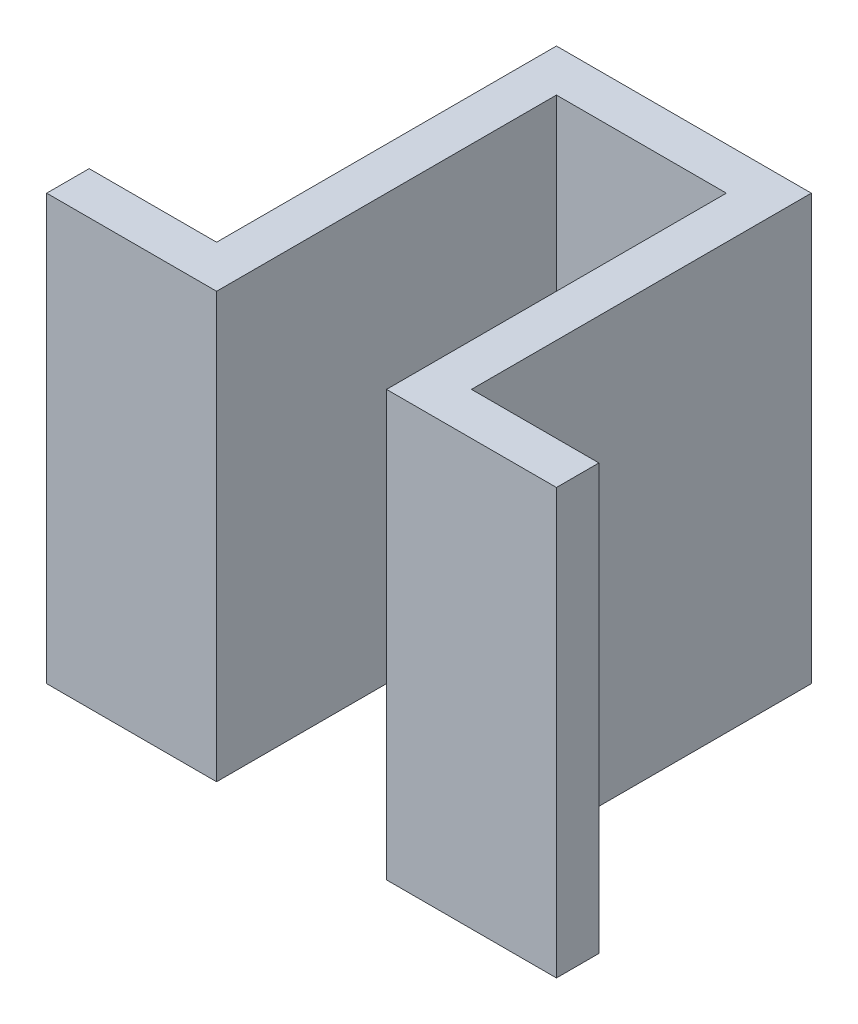
ISO-10303-21;
HEADER;
FILE_DESCRIPTION(('STEP AP214'),'2;1');
FILE_NAME('part.step','',(''),(''),'','','');
FILE_SCHEMA(('AUTOMOTIVE_DESIGN { 1 0 10303 214 1 1 1 1 }'));
ENDSEC;
DATA;
#1=APPLICATION_CONTEXT('core data for automotive mechanical design processes');
#2=APPLICATION_PROTOCOL_DEFINITION('international standard','automotive_design',2000,#1);
#3=PRODUCT_CONTEXT('',#1,'mechanical');
#4=PRODUCT('Part','Part','',(#3));
#5=PRODUCT_RELATED_PRODUCT_CATEGORY('part','',(#4));
#6=PRODUCT_DEFINITION_FORMATION('','',#4);
#7=PRODUCT_DEFINITION_CONTEXT('part definition',#1,'design');
#8=PRODUCT_DEFINITION('design','',#6,#7);
#9=PRODUCT_DEFINITION_SHAPE('','',#8);
#10=(LENGTH_UNIT() NAMED_UNIT(*) SI_UNIT(.MILLI.,.METRE.));
#11=(NAMED_UNIT(*) PLANE_ANGLE_UNIT() SI_UNIT($,.RADIAN.));
#12=(NAMED_UNIT(*) SI_UNIT($,.STERADIAN.) SOLID_ANGLE_UNIT());
#13=UNCERTAINTY_MEASURE_WITH_UNIT(LENGTH_MEASURE(1.E-05),#10,'distance_accuracy_value','');
#14=(GEOMETRIC_REPRESENTATION_CONTEXT(3) GLOBAL_UNCERTAINTY_ASSIGNED_CONTEXT((#13)) GLOBAL_UNIT_ASSIGNED_CONTEXT((#10,
#11,#12)) REPRESENTATION_CONTEXT('',''));
#15=CARTESIAN_POINT('',(0.,0.,0.));
#16=DIRECTION('',(0.,0.,1.));
#17=DIRECTION('',(1.,0.,0.));
#18=AXIS2_PLACEMENT_3D('',#15,#16,#17);
#19=CARTESIAN_POINT('',(38.1,127.,88.9));
#20=DIRECTION('',(0.,0.,1.));
#21=DIRECTION('',(1.,0.,0.));
#22=AXIS2_PLACEMENT_3D('',#19,#20,#21);
#23=PLANE('',#22);
#24=DIRECTION('',(-1.,0.,0.));
#25=VECTOR('',#24,1.);
#26=CARTESIAN_POINT('',(38.1,0.,88.9));
#27=LINE('',#26,#25);
#28=CARTESIAN_POINT('',(76.2,0.,88.9));
#29=VERTEX_POINT('',#28);
#30=CARTESIAN_POINT('',(38.1,0.,88.9));
#31=VERTEX_POINT('',#30);
#32=EDGE_CURVE('E159',#29,#31,#27,.T.);
#33=ORIENTED_EDGE('',*,*,#32,.T.);
#34=DIRECTION('',(0.,-1.,0.));
#35=VECTOR('',#34,1.);
#36=CARTESIAN_POINT('',(38.1,127.,88.9));
#37=LINE('',#36,#35);
#38=CARTESIAN_POINT('',(38.1,127.,88.9));
#39=VERTEX_POINT('',#38);
#40=EDGE_CURVE('E11',#39,#31,#37,.T.);
#41=ORIENTED_EDGE('',*,*,#40,.F.);
#42=DIRECTION('',(-1.,0.,0.));
#43=VECTOR('',#42,1.);
#44=CARTESIAN_POINT('',(38.1,127.,88.9));
#45=LINE('',#44,#43);
#46=CARTESIAN_POINT('',(76.2,127.,88.9));
#47=VERTEX_POINT('',#46);
#48=EDGE_CURVE('E181',#47,#39,#45,.T.);
#49=ORIENTED_EDGE('',*,*,#48,.F.);
#50=DIRECTION('',(0.,-1.,0.));
#51=VECTOR('',#50,1.);
#52=CARTESIAN_POINT('',(76.2,127.,88.9));
#53=LINE('',#52,#51);
#54=EDGE_CURVE('E155',#47,#29,#53,.T.);
#55=ORIENTED_EDGE('',*,*,#54,.T.);
#56=EDGE_LOOP('',(#33,#41,#49,#55));
#57=FACE_BOUND('',#56,.T.);
#58=ADVANCED_FACE('F39',(#57),#23,.F.);
#59=CARTESIAN_POINT('',(38.1,127.,-12.7));
#60=DIRECTION('',(-1.,0.,0.));
#61=DIRECTION('',(0.,0.,1.));
#62=AXIS2_PLACEMENT_3D('',#59,#60,#61);
#63=PLANE('',#62);
#64=DIRECTION('',(0.,0.,-1.));
#65=VECTOR('',#64,1.);
#66=CARTESIAN_POINT('',(38.1,0.,-12.7));
#67=LINE('',#66,#65);
#68=CARTESIAN_POINT('',(38.1,0.,-12.7));
#69=VERTEX_POINT('',#68);
#70=EDGE_CURVE('E162',#31,#69,#67,.T.);
#71=ORIENTED_EDGE('',*,*,#70,.T.);
#72=DIRECTION('',(0.,-1.,0.));
#73=VECTOR('',#72,1.);
#74=CARTESIAN_POINT('',(38.1,127.,-12.7));
#75=LINE('',#74,#73);
#76=CARTESIAN_POINT('',(38.1,127.,-12.7));
#77=VERTEX_POINT('',#76);
#78=EDGE_CURVE('E47',#77,#69,#75,.T.);
#79=ORIENTED_EDGE('',*,*,#78,.F.);
#80=DIRECTION('',(0.,0.,-1.));
#81=VECTOR('',#80,1.);
#82=CARTESIAN_POINT('',(38.1,127.,-12.7));
#83=LINE('',#82,#81);
#84=EDGE_CURVE('E110',#39,#77,#83,.T.);
#85=ORIENTED_EDGE('',*,*,#84,.F.);
#86=ORIENTED_EDGE('',*,*,#40,.T.);
#87=EDGE_LOOP('',(#71,#79,#85,#86));
#88=FACE_BOUND('',#87,.T.);
#89=ADVANCED_FACE('F259',(#88),#63,.F.);
#90=CARTESIAN_POINT('',(-38.1,127.,-12.7));
#91=DIRECTION('',(0.,0.,1.));
#92=DIRECTION('',(1.,0.,0.));
#93=AXIS2_PLACEMENT_3D('',#90,#91,#92);
#94=PLANE('',#93);
#95=DIRECTION('',(-1.,0.,0.));
#96=VECTOR('',#95,1.);
#97=CARTESIAN_POINT('',(-38.1,0.,-12.7));
#98=LINE('',#97,#96);
#99=CARTESIAN_POINT('',(-38.1,0.,-12.7));
#100=VERTEX_POINT('',#99);
#101=EDGE_CURVE('E164',#69,#100,#98,.T.);
#102=ORIENTED_EDGE('',*,*,#101,.T.);
#103=DIRECTION('',(0.,-1.,0.));
#104=VECTOR('',#103,1.);
#105=CARTESIAN_POINT('',(-38.1,127.,-12.7));
#106=LINE('',#105,#104);
#107=CARTESIAN_POINT('',(-38.1,127.,-12.7));
#108=VERTEX_POINT('',#107);
#109=EDGE_CURVE('E200',#108,#100,#106,.T.);
#110=ORIENTED_EDGE('',*,*,#109,.F.);
#111=DIRECTION('',(-1.,0.,0.));
#112=VECTOR('',#111,1.);
#113=CARTESIAN_POINT('',(-38.1,127.,-12.7));
#114=LINE('',#113,#112);
#115=EDGE_CURVE('E208',#77,#108,#114,.T.);
#116=ORIENTED_EDGE('',*,*,#115,.F.);
#117=ORIENTED_EDGE('',*,*,#78,.T.);
#118=EDGE_LOOP('',(#102,#110,#116,#117));
#119=FACE_BOUND('',#118,.T.);
#120=ADVANCED_FACE('F206',(#119),#94,.F.);
#121=CARTESIAN_POINT('',(-38.1,127.,88.9));
#122=DIRECTION('',(1.,0.,0.));
#123=DIRECTION('',(0.,0.,-1.));
#124=AXIS2_PLACEMENT_3D('',#121,#122,#123);
#125=PLANE('',#124);
#126=DIRECTION('',(0.,0.,1.));
#127=VECTOR('',#126,1.);
#128=CARTESIAN_POINT('',(-38.1,0.,88.9));
#129=LINE('',#128,#127);
#130=CARTESIAN_POINT('',(-38.1,0.,88.9));
#131=VERTEX_POINT('',#130);
#132=EDGE_CURVE('E166',#100,#131,#129,.T.);
#133=ORIENTED_EDGE('',*,*,#132,.T.);
#134=DIRECTION('',(0.,-1.,0.));
#135=VECTOR('',#134,1.);
#136=CARTESIAN_POINT('',(-38.1,127.,88.9));
#137=LINE('',#136,#135);
#138=CARTESIAN_POINT('',(-38.1,127.,88.9));
#139=VERTEX_POINT('',#138);
#140=EDGE_CURVE('E197',#139,#131,#137,.T.);
#141=ORIENTED_EDGE('',*,*,#140,.F.);
#142=DIRECTION('',(0.,0.,1.));
#143=VECTOR('',#142,1.);
#144=CARTESIAN_POINT('',(-38.1,127.,88.9));
#145=LINE('',#144,#143);
#146=EDGE_CURVE('E226',#108,#139,#145,.T.);
#147=ORIENTED_EDGE('',*,*,#146,.F.);
#148=ORIENTED_EDGE('',*,*,#109,.T.);
#149=EDGE_LOOP('',(#133,#141,#147,#148));
#150=FACE_BOUND('',#149,.T.);
#151=ADVANCED_FACE('F217',(#150),#125,.F.);
#152=CARTESIAN_POINT('',(-76.2,127.,88.9));
#153=DIRECTION('',(0.,0.,1.));
#154=DIRECTION('',(1.,0.,0.));
#155=AXIS2_PLACEMENT_3D('',#152,#153,#154);
#156=PLANE('',#155);
#157=DIRECTION('',(-1.,0.,0.));
#158=VECTOR('',#157,1.);
#159=CARTESIAN_POINT('',(-76.2,0.,88.9));
#160=LINE('',#159,#158);
#161=CARTESIAN_POINT('',(-76.2,0.,88.9));
#162=VERTEX_POINT('',#161);
#163=EDGE_CURVE('E168',#131,#162,#160,.T.);
#164=ORIENTED_EDGE('',*,*,#163,.T.);
#165=DIRECTION('',(0.,-1.,0.));
#166=VECTOR('',#165,1.);
#167=CARTESIAN_POINT('',(-76.2,127.,88.9));
#168=LINE('',#167,#166);
#169=CARTESIAN_POINT('',(-76.2,127.,88.9));
#170=VERTEX_POINT('',#169);
#171=EDGE_CURVE('E194',#170,#162,#168,.T.);
#172=ORIENTED_EDGE('',*,*,#171,.F.);
#173=DIRECTION('',(-1.,0.,0.));
#174=VECTOR('',#173,1.);
#175=CARTESIAN_POINT('',(-76.2,127.,88.9));
#176=LINE('',#175,#174);
#177=EDGE_CURVE('E223',#139,#170,#176,.T.);
#178=ORIENTED_EDGE('',*,*,#177,.F.);
#179=ORIENTED_EDGE('',*,*,#140,.T.);
#180=EDGE_LOOP('',(#164,#172,#178,#179));
#181=FACE_BOUND('',#180,.T.);
#182=ADVANCED_FACE('F221',(#181),#156,.F.);
#183=CARTESIAN_POINT('',(-76.2,127.,101.6));
#184=DIRECTION('',(1.,0.,0.));
#185=DIRECTION('',(0.,0.,-1.));
#186=AXIS2_PLACEMENT_3D('',#183,#184,#185);
#187=PLANE('',#186);
#188=DIRECTION('',(0.,0.,1.));
#189=VECTOR('',#188,1.);
#190=CARTESIAN_POINT('',(-76.2,0.,101.6));
#191=LINE('',#190,#189);
#192=CARTESIAN_POINT('',(-76.2,0.,101.6));
#193=VERTEX_POINT('',#192);
#194=EDGE_CURVE('E170',#162,#193,#191,.T.);
#195=ORIENTED_EDGE('',*,*,#194,.T.);
#196=DIRECTION('',(0.,-1.,0.));
#197=VECTOR('',#196,1.);
#198=CARTESIAN_POINT('',(-76.2,127.,101.6));
#199=LINE('',#198,#197);
#200=CARTESIAN_POINT('',(-76.2,127.,101.6));
#201=VERTEX_POINT('',#200);
#202=EDGE_CURVE('E191',#201,#193,#199,.T.);
#203=ORIENTED_EDGE('',*,*,#202,.F.);
#204=DIRECTION('',(0.,0.,1.));
#205=VECTOR('',#204,1.);
#206=CARTESIAN_POINT('',(-76.2,127.,101.6));
#207=LINE('',#206,#205);
#208=EDGE_CURVE('E225',#170,#201,#207,.T.);
#209=ORIENTED_EDGE('',*,*,#208,.F.);
#210=ORIENTED_EDGE('',*,*,#171,.T.);
#211=EDGE_LOOP('',(#195,#203,#209,#210));
#212=FACE_BOUND('',#211,.T.);
#213=ADVANCED_FACE('F272',(#212),#187,.F.);
#214=CARTESIAN_POINT('',(-25.4,127.,101.6));
#215=DIRECTION('',(0.,0.,-1.));
#216=DIRECTION('',(-1.,0.,0.));
#217=AXIS2_PLACEMENT_3D('',#214,#215,#216);
#218=PLANE('',#217);
#219=DIRECTION('',(1.,0.,0.));
#220=VECTOR('',#219,1.);
#221=CARTESIAN_POINT('',(-25.4,0.,101.6));
#222=LINE('',#221,#220);
#223=CARTESIAN_POINT('',(-25.4,0.,101.6));
#224=VERTEX_POINT('',#223);
#225=EDGE_CURVE('E172',#193,#224,#222,.T.);
#226=ORIENTED_EDGE('',*,*,#225,.T.);
#227=DIRECTION('',(0.,-1.,0.));
#228=VECTOR('',#227,1.);
#229=CARTESIAN_POINT('',(-25.4,127.,101.6));
#230=LINE('',#229,#228);
#231=CARTESIAN_POINT('',(-25.4,127.,101.6));
#232=VERTEX_POINT('',#231);
#233=EDGE_CURVE('E188',#232,#224,#230,.T.);
#234=ORIENTED_EDGE('',*,*,#233,.F.);
#235=DIRECTION('',(1.,0.,0.));
#236=VECTOR('',#235,1.);
#237=CARTESIAN_POINT('',(-25.4,127.,101.6));
#238=LINE('',#237,#236);
#239=EDGE_CURVE('E228',#201,#232,#238,.T.);
#240=ORIENTED_EDGE('',*,*,#239,.F.);
#241=ORIENTED_EDGE('',*,*,#202,.T.);
#242=EDGE_LOOP('',(#226,#234,#240,#241));
#243=FACE_BOUND('',#242,.T.);
#244=ADVANCED_FACE('F275',(#243),#218,.F.);
#245=CARTESIAN_POINT('',(-25.4,127.,0.));
#246=DIRECTION('',(-1.,0.,0.));
#247=DIRECTION('',(0.,0.,1.));
#248=AXIS2_PLACEMENT_3D('',#245,#246,#247);
#249=PLANE('',#248);
#250=DIRECTION('',(0.,0.,-1.));
#251=VECTOR('',#250,1.);
#252=CARTESIAN_POINT('',(-25.4,0.,0.));
#253=LINE('',#252,#251);
#254=CARTESIAN_POINT('',(-25.4,0.,0.));
#255=VERTEX_POINT('',#254);
#256=EDGE_CURVE('E174',#224,#255,#253,.T.);
#257=ORIENTED_EDGE('',*,*,#256,.T.);
#258=DIRECTION('',(0.,-1.,0.));
#259=VECTOR('',#258,1.);
#260=CARTESIAN_POINT('',(-25.4,127.,0.));
#261=LINE('',#260,#259);
#262=CARTESIAN_POINT('',(-25.4,127.,0.));
#263=VERTEX_POINT('',#262);
#264=EDGE_CURVE('E185',#263,#255,#261,.T.);
#265=ORIENTED_EDGE('',*,*,#264,.F.);
#266=DIRECTION('',(0.,0.,-1.));
#267=VECTOR('',#266,1.);
#268=CARTESIAN_POINT('',(-25.4,127.,0.));
#269=LINE('',#268,#267);
#270=EDGE_CURVE('E234',#232,#263,#269,.T.);
#271=ORIENTED_EDGE('',*,*,#270,.F.);
#272=ORIENTED_EDGE('',*,*,#233,.T.);
#273=EDGE_LOOP('',(#257,#265,#271,#272));
#274=FACE_BOUND('',#273,.T.);
#275=ADVANCED_FACE('F240',(#274),#249,.F.);
#276=CARTESIAN_POINT('',(25.4,127.,0.));
#277=DIRECTION('',(0.,0.,-1.));
#278=DIRECTION('',(-1.,0.,0.));
#279=AXIS2_PLACEMENT_3D('',#276,#277,#278);
#280=PLANE('',#279);
#281=DIRECTION('',(1.,0.,0.));
#282=VECTOR('',#281,1.);
#283=CARTESIAN_POINT('',(25.4,0.,0.));
#284=LINE('',#283,#282);
#285=CARTESIAN_POINT('',(25.4,0.,0.));
#286=VERTEX_POINT('',#285);
#287=EDGE_CURVE('E176',#255,#286,#284,.T.);
#288=ORIENTED_EDGE('',*,*,#287,.T.);
#289=DIRECTION('',(0.,-1.,0.));
#290=VECTOR('',#289,1.);
#291=CARTESIAN_POINT('',(25.4,127.,0.));
#292=LINE('',#291,#290);
#293=CARTESIAN_POINT('',(25.4,127.,0.));
#294=VERTEX_POINT('',#293);
#295=EDGE_CURVE('E150',#294,#286,#292,.T.);
#296=ORIENTED_EDGE('',*,*,#295,.F.);
#297=DIRECTION('',(1.,0.,0.));
#298=VECTOR('',#297,1.);
#299=CARTESIAN_POINT('',(25.4,127.,0.));
#300=LINE('',#299,#298);
#301=EDGE_CURVE('E141',#263,#294,#300,.T.);
#302=ORIENTED_EDGE('',*,*,#301,.F.);
#303=ORIENTED_EDGE('',*,*,#264,.T.);
#304=EDGE_LOOP('',(#288,#296,#302,#303));
#305=FACE_BOUND('',#304,.T.);
#306=ADVANCED_FACE('F244',(#305),#280,.F.);
#307=CARTESIAN_POINT('',(25.4,127.,101.6));
#308=DIRECTION('',(1.,0.,0.));
#309=DIRECTION('',(0.,0.,-1.));
#310=AXIS2_PLACEMENT_3D('',#307,#308,#309);
#311=PLANE('',#310);
#312=DIRECTION('',(0.,0.,1.));
#313=VECTOR('',#312,1.);
#314=CARTESIAN_POINT('',(25.4,0.,101.6));
#315=LINE('',#314,#313);
#316=CARTESIAN_POINT('',(25.4,0.,101.6));
#317=VERTEX_POINT('',#316);
#318=EDGE_CURVE('E149',#286,#317,#315,.T.);
#319=ORIENTED_EDGE('',*,*,#318,.T.);
#320=DIRECTION('',(0.,-1.,0.));
#321=VECTOR('',#320,1.);
#322=CARTESIAN_POINT('',(25.4,127.,101.6));
#323=LINE('',#322,#321);
#324=CARTESIAN_POINT('',(25.4,127.,101.6));
#325=VERTEX_POINT('',#324);
#326=EDGE_CURVE('E146',#325,#317,#323,.T.);
#327=ORIENTED_EDGE('',*,*,#326,.F.);
#328=DIRECTION('',(0.,0.,1.));
#329=VECTOR('',#328,1.);
#330=CARTESIAN_POINT('',(25.4,127.,101.6));
#331=LINE('',#330,#329);
#332=EDGE_CURVE('E135',#294,#325,#331,.T.);
#333=ORIENTED_EDGE('',*,*,#332,.F.);
#334=ORIENTED_EDGE('',*,*,#295,.T.);
#335=EDGE_LOOP('',(#319,#327,#333,#334));
#336=FACE_BOUND('',#335,.T.);
#337=ADVANCED_FACE('F147',(#336),#311,.F.);
#338=CARTESIAN_POINT('',(76.2,127.,101.6));
#339=DIRECTION('',(0.,0.,-1.));
#340=DIRECTION('',(-1.,0.,0.));
#341=AXIS2_PLACEMENT_3D('',#338,#339,#340);
#342=PLANE('',#341);
#343=DIRECTION('',(1.,0.,0.));
#344=VECTOR('',#343,1.);
#345=CARTESIAN_POINT('',(76.2,0.,101.6));
#346=LINE('',#345,#344);
#347=CARTESIAN_POINT('',(76.2,0.,101.6));
#348=VERTEX_POINT('',#347);
#349=EDGE_CURVE('E96',#317,#348,#346,.T.);
#350=ORIENTED_EDGE('',*,*,#349,.T.);
#351=DIRECTION('',(0.,-1.,0.));
#352=VECTOR('',#351,1.);
#353=CARTESIAN_POINT('',(76.2,127.,101.6));
#354=LINE('',#353,#352);
#355=CARTESIAN_POINT('',(76.2,127.,101.6));
#356=VERTEX_POINT('',#355);
#357=EDGE_CURVE('E151',#356,#348,#354,.T.);
#358=ORIENTED_EDGE('',*,*,#357,.F.);
#359=DIRECTION('',(1.,0.,0.));
#360=VECTOR('',#359,1.);
#361=CARTESIAN_POINT('',(76.2,127.,101.6));
#362=LINE('',#361,#360);
#363=EDGE_CURVE('E139',#325,#356,#362,.T.);
#364=ORIENTED_EDGE('',*,*,#363,.F.);
#365=ORIENTED_EDGE('',*,*,#326,.T.);
#366=EDGE_LOOP('',(#350,#358,#364,#365));
#367=FACE_BOUND('',#366,.T.);
#368=ADVANCED_FACE('F153',(#367),#342,.F.);
#369=CARTESIAN_POINT('',(76.2,127.,88.9));
#370=DIRECTION('',(-1.,0.,0.));
#371=DIRECTION('',(0.,0.,1.));
#372=AXIS2_PLACEMENT_3D('',#369,#370,#371);
#373=PLANE('',#372);
#374=DIRECTION('',(0.,0.,-1.));
#375=VECTOR('',#374,1.);
#376=CARTESIAN_POINT('',(76.2,0.,88.9));
#377=LINE('',#376,#375);
#378=EDGE_CURVE('E102',#348,#29,#377,.T.);
#379=ORIENTED_EDGE('',*,*,#378,.T.);
#380=ORIENTED_EDGE('',*,*,#54,.F.);
#381=DIRECTION('',(0.,0.,-1.));
#382=VECTOR('',#381,1.);
#383=CARTESIAN_POINT('',(76.2,127.,88.9));
#384=LINE('',#383,#382);
#385=EDGE_CURVE('E55',#356,#47,#384,.T.);
#386=ORIENTED_EDGE('',*,*,#385,.F.);
#387=ORIENTED_EDGE('',*,*,#357,.T.);
#388=EDGE_LOOP('',(#379,#380,#386,#387));
#389=FACE_BOUND('',#388,.T.);
#390=ADVANCED_FACE('F248',(#389),#373,.F.);
#391=CARTESIAN_POINT('',(0.,127.,0.));
#392=DIRECTION('',(0.,-1.,0.));
#393=DIRECTION('',(0.,0.,-1.));
#394=AXIS2_PLACEMENT_3D('',#391,#392,#393);
#395=PLANE('',#394);
#396=ORIENTED_EDGE('',*,*,#48,.T.);
#397=ORIENTED_EDGE('',*,*,#84,.T.);
#398=ORIENTED_EDGE('',*,*,#115,.T.);
#399=ORIENTED_EDGE('',*,*,#146,.T.);
#400=ORIENTED_EDGE('',*,*,#177,.T.);
#401=ORIENTED_EDGE('',*,*,#208,.T.);
#402=ORIENTED_EDGE('',*,*,#239,.T.);
#403=ORIENTED_EDGE('',*,*,#270,.T.);
#404=ORIENTED_EDGE('',*,*,#301,.T.);
#405=ORIENTED_EDGE('',*,*,#332,.T.);
#406=ORIENTED_EDGE('',*,*,#363,.T.);
#407=ORIENTED_EDGE('',*,*,#385,.T.);
#408=EDGE_LOOP('',(#396,#397,#398,#399,#400,#401,#402,#403,#404,#405,#406,#407));
#409=FACE_BOUND('',#408,.T.);
#410=ADVANCED_FACE('F137',(#409),#395,.F.);
#411=CARTESIAN_POINT('',(0.,0.,0.));
#412=DIRECTION('',(0.,-1.,0.));
#413=DIRECTION('',(0.,0.,-1.));
#414=AXIS2_PLACEMENT_3D('',#411,#412,#413);
#415=PLANE('',#414);
#416=ORIENTED_EDGE('',*,*,#32,.F.);
#417=ORIENTED_EDGE('',*,*,#378,.F.);
#418=ORIENTED_EDGE('',*,*,#349,.F.);
#419=ORIENTED_EDGE('',*,*,#318,.F.);
#420=ORIENTED_EDGE('',*,*,#287,.F.);
#421=ORIENTED_EDGE('',*,*,#256,.F.);
#422=ORIENTED_EDGE('',*,*,#225,.F.);
#423=ORIENTED_EDGE('',*,*,#194,.F.);
#424=ORIENTED_EDGE('',*,*,#163,.F.);
#425=ORIENTED_EDGE('',*,*,#132,.F.);
#426=ORIENTED_EDGE('',*,*,#101,.F.);
#427=ORIENTED_EDGE('',*,*,#70,.F.);
#428=EDGE_LOOP('',(#416,#417,#418,#419,#420,#421,#422,#423,#424,#425,#426,#427));
#429=FACE_BOUND('',#428,.T.);
#430=ADVANCED_FACE('F212',(#429),#415,.T.);
#431=CLOSED_SHELL('',(#58,#89,#120,#151,#182,#213,#244,#275,#306,#337,#368,#390,#410,#430));
#432=MANIFOLD_SOLID_BREP('B2',#431);
#433=ADVANCED_BREP_SHAPE_REPRESENTATION('',(#18,#432),#14);
#434=SHAPE_DEFINITION_REPRESENTATION(#9,#433);
ENDSEC;
END-ISO-10303-21;
